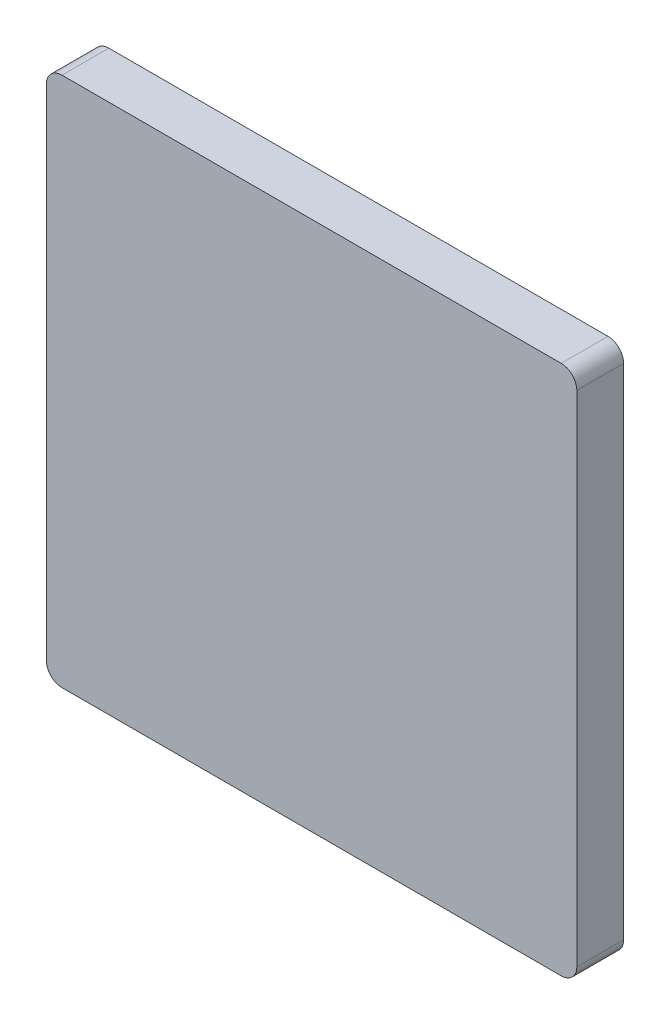
ISO-10303-21;
HEADER;
FILE_DESCRIPTION(('STEP AP214'),'2;1');
FILE_NAME('part.step','',(''),(''),'','','');
FILE_SCHEMA(('AUTOMOTIVE_DESIGN { 1 0 10303 214 1 1 1 1 }'));
ENDSEC;
DATA;
#1=APPLICATION_CONTEXT('core data for automotive mechanical design processes');
#2=APPLICATION_PROTOCOL_DEFINITION('international standard','automotive_design',2000,#1);
#3=PRODUCT_CONTEXT('',#1,'mechanical');
#4=PRODUCT('Part','Part','',(#3));
#5=PRODUCT_RELATED_PRODUCT_CATEGORY('part','',(#4));
#6=PRODUCT_DEFINITION_FORMATION('','',#4);
#7=PRODUCT_DEFINITION_CONTEXT('part definition',#1,'design');
#8=PRODUCT_DEFINITION('design','',#6,#7);
#9=PRODUCT_DEFINITION_SHAPE('','',#8);
#10=(LENGTH_UNIT() NAMED_UNIT(*) SI_UNIT(.MILLI.,.METRE.));
#11=(NAMED_UNIT(*) PLANE_ANGLE_UNIT() SI_UNIT($,.RADIAN.));
#12=(NAMED_UNIT(*) SI_UNIT($,.STERADIAN.) SOLID_ANGLE_UNIT());
#13=UNCERTAINTY_MEASURE_WITH_UNIT(LENGTH_MEASURE(1.E-05),#10,'distance_accuracy_value','');
#14=(GEOMETRIC_REPRESENTATION_CONTEXT(3) GLOBAL_UNCERTAINTY_ASSIGNED_CONTEXT((#13)) GLOBAL_UNIT_ASSIGNED_CONTEXT((#10,
#11,#12)) REPRESENTATION_CONTEXT('',''));
#15=CARTESIAN_POINT('',(0.,0.,0.));
#16=DIRECTION('',(0.,0.,1.));
#17=DIRECTION('',(1.,0.,0.));
#18=AXIS2_PLACEMENT_3D('',#15,#16,#17);
#19=CARTESIAN_POINT('',(0.,0.,0.6));
#20=DIRECTION('',(1.,0.,0.));
#21=DIRECTION('',(0.,0.,-1.));
#22=AXIS2_PLACEMENT_3D('',#19,#20,#21);
#23=PLANE('',#22);
#24=DIRECTION('',(0.,-1.,0.));
#25=VECTOR('',#24,1.);
#26=CARTESIAN_POINT('',(0.,0.,0.));
#27=LINE('',#26,#25);
#28=CARTESIAN_POINT('',(0.,6.6,0.));
#29=VERTEX_POINT('',#28);
#30=CARTESIAN_POINT('',(0.,0.2,0.));
#31=VERTEX_POINT('',#30);
#32=EDGE_CURVE('E127',#29,#31,#27,.T.);
#33=ORIENTED_EDGE('',*,*,#32,.T.);
#34=DIRECTION('',(0.,0.,-1.));
#35=VECTOR('',#34,1.);
#36=CARTESIAN_POINT('',(0.,0.2,0.6));
#37=LINE('',#36,#35);
#38=CARTESIAN_POINT('',(0.,0.2,0.6));
#39=VERTEX_POINT('',#38);
#40=EDGE_CURVE('E105',#31,#39,#37,.F.);
#41=ORIENTED_EDGE('',*,*,#40,.T.);
#42=DIRECTION('',(0.,-1.,0.));
#43=VECTOR('',#42,1.);
#44=CARTESIAN_POINT('',(0.,0.,0.6));
#45=LINE('',#44,#43);
#46=CARTESIAN_POINT('',(0.,6.6,0.6));
#47=VERTEX_POINT('',#46);
#48=EDGE_CURVE('E136',#47,#39,#45,.T.);
#49=ORIENTED_EDGE('',*,*,#48,.F.);
#50=DIRECTION('',(0.,0.,-1.));
#51=VECTOR('',#50,1.);
#52=CARTESIAN_POINT('',(0.,6.6,0.6));
#53=LINE('',#52,#51);
#54=EDGE_CURVE('E110',#47,#29,#53,.T.);
#55=ORIENTED_EDGE('',*,*,#54,.T.);
#56=EDGE_LOOP('',(#33,#41,#49,#55));
#57=FACE_BOUND('',#56,.T.);
#58=ADVANCED_FACE('F34',(#57),#23,.F.);
#59=CARTESIAN_POINT('',(0.,0.,0.6));
#60=DIRECTION('',(0.,1.,0.));
#61=DIRECTION('',(0.,0.,1.));
#62=AXIS2_PLACEMENT_3D('',#59,#60,#61);
#63=PLANE('',#62);
#64=DIRECTION('',(1.,0.,0.));
#65=VECTOR('',#64,1.);
#66=CARTESIAN_POINT('',(0.,0.,0.6));
#67=LINE('',#66,#65);
#68=CARTESIAN_POINT('',(0.2,0.,0.6));
#69=VERTEX_POINT('',#68);
#70=CARTESIAN_POINT('',(6.6,0.,0.6));
#71=VERTEX_POINT('',#70);
#72=EDGE_CURVE('E120',#69,#71,#67,.T.);
#73=ORIENTED_EDGE('',*,*,#72,.F.);
#74=DIRECTION('',(0.,0.,-1.));
#75=VECTOR('',#74,1.);
#76=CARTESIAN_POINT('',(0.2,0.,0.6));
#77=LINE('',#76,#75);
#78=CARTESIAN_POINT('',(0.2,0.,0.));
#79=VERTEX_POINT('',#78);
#80=EDGE_CURVE('E104',#69,#79,#77,.T.);
#81=ORIENTED_EDGE('',*,*,#80,.T.);
#82=DIRECTION('',(1.,0.,0.));
#83=VECTOR('',#82,1.);
#84=CARTESIAN_POINT('',(0.,0.,0.));
#85=LINE('',#84,#83);
#86=CARTESIAN_POINT('',(6.6,0.,0.));
#87=VERTEX_POINT('',#86);
#88=EDGE_CURVE('E117',#79,#87,#85,.T.);
#89=ORIENTED_EDGE('',*,*,#88,.T.);
#90=DIRECTION('',(0.,0.,-1.));
#91=VECTOR('',#90,1.);
#92=CARTESIAN_POINT('',(6.6,0.,0.6));
#93=LINE('',#92,#91);
#94=EDGE_CURVE('E122',#87,#71,#93,.F.);
#95=ORIENTED_EDGE('',*,*,#94,.T.);
#96=EDGE_LOOP('',(#73,#81,#89,#95));
#97=FACE_BOUND('',#96,.T.);
#98=ADVANCED_FACE('F116',(#97),#63,.F.);
#99=CARTESIAN_POINT('',(6.8,0.,0.6));
#100=DIRECTION('',(-1.,0.,0.));
#101=DIRECTION('',(0.,0.,1.));
#102=AXIS2_PLACEMENT_3D('',#99,#100,#101);
#103=PLANE('',#102);
#104=DIRECTION('',(0.,1.,0.));
#105=VECTOR('',#104,1.);
#106=CARTESIAN_POINT('',(6.8,0.,0.6));
#107=LINE('',#106,#105);
#108=CARTESIAN_POINT('',(6.8,0.2,0.6));
#109=VERTEX_POINT('',#108);
#110=CARTESIAN_POINT('',(6.8,6.6,0.6));
#111=VERTEX_POINT('',#110);
#112=EDGE_CURVE('E162',#109,#111,#107,.T.);
#113=ORIENTED_EDGE('',*,*,#112,.F.);
#114=DIRECTION('',(0.,0.,-1.));
#115=VECTOR('',#114,1.);
#116=CARTESIAN_POINT('',(6.8,0.2,0.6));
#117=LINE('',#116,#115);
#118=CARTESIAN_POINT('',(6.8,0.2,0.));
#119=VERTEX_POINT('',#118);
#120=EDGE_CURVE('E155',#109,#119,#117,.T.);
#121=ORIENTED_EDGE('',*,*,#120,.T.);
#122=DIRECTION('',(0.,1.,0.));
#123=VECTOR('',#122,1.);
#124=CARTESIAN_POINT('',(6.8,0.,0.));
#125=LINE('',#124,#123);
#126=CARTESIAN_POINT('',(6.8,6.6,0.));
#127=VERTEX_POINT('',#126);
#128=EDGE_CURVE('E126',#119,#127,#125,.T.);
#129=ORIENTED_EDGE('',*,*,#128,.T.);
#130=DIRECTION('',(0.,0.,-1.));
#131=VECTOR('',#130,1.);
#132=CARTESIAN_POINT('',(6.8,6.6,0.6));
#133=LINE('',#132,#131);
#134=EDGE_CURVE('E153',#127,#111,#133,.F.);
#135=ORIENTED_EDGE('',*,*,#134,.T.);
#136=EDGE_LOOP('',(#113,#121,#129,#135));
#137=FACE_BOUND('',#136,.T.);
#138=ADVANCED_FACE('F160',(#137),#103,.F.);
#139=CARTESIAN_POINT('',(0.,6.8,0.6));
#140=DIRECTION('',(0.,-1.,0.));
#141=DIRECTION('',(0.,0.,-1.));
#142=AXIS2_PLACEMENT_3D('',#139,#140,#141);
#143=PLANE('',#142);
#144=DIRECTION('',(-1.,0.,0.));
#145=VECTOR('',#144,1.);
#146=CARTESIAN_POINT('',(0.,6.8,0.6));
#147=LINE('',#146,#145);
#148=CARTESIAN_POINT('',(6.6,6.8,0.6));
#149=VERTEX_POINT('',#148);
#150=CARTESIAN_POINT('',(0.2,6.8,0.6));
#151=VERTEX_POINT('',#150);
#152=EDGE_CURVE('E137',#149,#151,#147,.T.);
#153=ORIENTED_EDGE('',*,*,#152,.F.);
#154=DIRECTION('',(0.,0.,-1.));
#155=VECTOR('',#154,1.);
#156=CARTESIAN_POINT('',(6.6,6.8,0.6));
#157=LINE('',#156,#155);
#158=CARTESIAN_POINT('',(6.6,6.8,0.));
#159=VERTEX_POINT('',#158);
#160=EDGE_CURVE('E11',#149,#159,#157,.T.);
#161=ORIENTED_EDGE('',*,*,#160,.T.);
#162=DIRECTION('',(-1.,0.,0.));
#163=VECTOR('',#162,1.);
#164=CARTESIAN_POINT('',(0.,6.8,0.));
#165=LINE('',#164,#163);
#166=CARTESIAN_POINT('',(0.2,6.8,0.));
#167=VERTEX_POINT('',#166);
#168=EDGE_CURVE('E130',#159,#167,#165,.T.);
#169=ORIENTED_EDGE('',*,*,#168,.T.);
#170=DIRECTION('',(0.,0.,-1.));
#171=VECTOR('',#170,1.);
#172=CARTESIAN_POINT('',(0.2,6.8,0.6));
#173=LINE('',#172,#171);
#174=EDGE_CURVE('E42',#167,#151,#173,.F.);
#175=ORIENTED_EDGE('',*,*,#174,.T.);
#176=EDGE_LOOP('',(#153,#161,#169,#175));
#177=FACE_BOUND('',#176,.T.);
#178=ADVANCED_FACE('F169',(#177),#143,.F.);
#179=CARTESIAN_POINT('',(0.,0.,0.6));
#180=DIRECTION('',(0.,0.,-1.));
#181=DIRECTION('',(-1.,0.,0.));
#182=AXIS2_PLACEMENT_3D('',#179,#180,#181);
#183=PLANE('',#182);
#184=ORIENTED_EDGE('',*,*,#48,.T.);
#185=CARTESIAN_POINT('',(0.2,0.2,0.6));
#186=DIRECTION('',(0.,0.,-1.));
#187=DIRECTION('',(-1.,0.,0.));
#188=AXIS2_PLACEMENT_3D('',#185,#186,#187);
#189=CIRCLE('',#188,0.2);
#190=EDGE_CURVE('E151',#39,#69,#189,.F.);
#191=ORIENTED_EDGE('',*,*,#190,.T.);
#192=ORIENTED_EDGE('',*,*,#72,.T.);
#193=CARTESIAN_POINT('',(6.6,0.2,0.6));
#194=DIRECTION('',(0.,0.,-1.));
#195=DIRECTION('',(-1.,0.,0.));
#196=AXIS2_PLACEMENT_3D('',#193,#194,#195);
#197=CIRCLE('',#196,0.2);
#198=EDGE_CURVE('E149',#71,#109,#197,.F.);
#199=ORIENTED_EDGE('',*,*,#198,.T.);
#200=ORIENTED_EDGE('',*,*,#112,.T.);
#201=CARTESIAN_POINT('',(6.6,6.6,0.6));
#202=DIRECTION('',(0.,0.,-1.));
#203=DIRECTION('',(-1.,0.,0.));
#204=AXIS2_PLACEMENT_3D('',#201,#202,#203);
#205=CIRCLE('',#204,0.2);
#206=EDGE_CURVE('E55',#111,#149,#205,.F.);
#207=ORIENTED_EDGE('',*,*,#206,.T.);
#208=ORIENTED_EDGE('',*,*,#152,.T.);
#209=CARTESIAN_POINT('',(0.2,6.6,0.6));
#210=DIRECTION('',(0.,0.,-1.));
#211=DIRECTION('',(-1.,0.,0.));
#212=AXIS2_PLACEMENT_3D('',#209,#210,#211);
#213=CIRCLE('',#212,0.2);
#214=EDGE_CURVE('E146',#151,#47,#213,.F.);
#215=ORIENTED_EDGE('',*,*,#214,.T.);
#216=EDGE_LOOP('',(#184,#191,#192,#199,#200,#207,#208,#215));
#217=FACE_BOUND('',#216,.T.);
#218=ADVANCED_FACE('F176',(#217),#183,.F.);
#219=CARTESIAN_POINT('',(0.,0.,0.));
#220=DIRECTION('',(0.,0.,-1.));
#221=DIRECTION('',(-1.,0.,0.));
#222=AXIS2_PLACEMENT_3D('',#219,#220,#221);
#223=PLANE('',#222);
#224=ORIENTED_EDGE('',*,*,#88,.F.);
#225=CARTESIAN_POINT('',(0.2,0.2,0.));
#226=DIRECTION('',(0.,0.,-1.));
#227=DIRECTION('',(-1.,0.,0.));
#228=AXIS2_PLACEMENT_3D('',#225,#226,#227);
#229=CIRCLE('',#228,0.2);
#230=EDGE_CURVE('E100',#79,#31,#229,.T.);
#231=ORIENTED_EDGE('',*,*,#230,.T.);
#232=ORIENTED_EDGE('',*,*,#32,.F.);
#233=CARTESIAN_POINT('',(0.2,6.6,0.));
#234=DIRECTION('',(0.,0.,-1.));
#235=DIRECTION('',(-1.,0.,0.));
#236=AXIS2_PLACEMENT_3D('',#233,#234,#235);
#237=CIRCLE('',#236,0.2);
#238=EDGE_CURVE('E121',#29,#167,#237,.T.);
#239=ORIENTED_EDGE('',*,*,#238,.T.);
#240=ORIENTED_EDGE('',*,*,#168,.F.);
#241=CARTESIAN_POINT('',(6.6,6.6,0.));
#242=DIRECTION('',(0.,0.,-1.));
#243=DIRECTION('',(-1.,0.,0.));
#244=AXIS2_PLACEMENT_3D('',#241,#242,#243);
#245=CIRCLE('',#244,0.2);
#246=EDGE_CURVE('E140',#159,#127,#245,.T.);
#247=ORIENTED_EDGE('',*,*,#246,.T.);
#248=ORIENTED_EDGE('',*,*,#128,.F.);
#249=CARTESIAN_POINT('',(6.6,0.2,0.));
#250=DIRECTION('',(0.,0.,-1.));
#251=DIRECTION('',(-1.,0.,0.));
#252=AXIS2_PLACEMENT_3D('',#249,#250,#251);
#253=CIRCLE('',#252,0.2);
#254=EDGE_CURVE('E111',#119,#87,#253,.T.);
#255=ORIENTED_EDGE('',*,*,#254,.T.);
#256=EDGE_LOOP('',(#224,#231,#232,#239,#240,#247,#248,#255));
#257=FACE_BOUND('',#256,.T.);
#258=ADVANCED_FACE('F124',(#257),#223,.T.);
#259=CARTESIAN_POINT('',(0.2,0.2,0.6));
#260=DIRECTION('',(0.,0.,-1.));
#261=DIRECTION('',(-1.,0.,0.));
#262=AXIS2_PLACEMENT_3D('',#259,#260,#261);
#263=CYLINDRICAL_SURFACE('',#262,0.2);
#264=ORIENTED_EDGE('',*,*,#190,.F.);
#265=ORIENTED_EDGE('',*,*,#40,.F.);
#266=ORIENTED_EDGE('',*,*,#230,.F.);
#267=ORIENTED_EDGE('',*,*,#80,.F.);
#268=EDGE_LOOP('',(#264,#265,#266,#267));
#269=FACE_BOUND('',#268,.T.);
#270=ADVANCED_FACE('F103',(#269),#263,.T.);
#271=CARTESIAN_POINT('',(6.6,0.2,0.6));
#272=DIRECTION('',(0.,0.,-1.));
#273=DIRECTION('',(-1.,0.,0.));
#274=AXIS2_PLACEMENT_3D('',#271,#272,#273);
#275=CYLINDRICAL_SURFACE('',#274,0.2);
#276=ORIENTED_EDGE('',*,*,#198,.F.);
#277=ORIENTED_EDGE('',*,*,#94,.F.);
#278=ORIENTED_EDGE('',*,*,#254,.F.);
#279=ORIENTED_EDGE('',*,*,#120,.F.);
#280=EDGE_LOOP('',(#276,#277,#278,#279));
#281=FACE_BOUND('',#280,.T.);
#282=ADVANCED_FACE('F184',(#281),#275,.T.);
#283=CARTESIAN_POINT('',(6.6,6.6,0.6));
#284=DIRECTION('',(0.,0.,-1.));
#285=DIRECTION('',(-1.,0.,0.));
#286=AXIS2_PLACEMENT_3D('',#283,#284,#285);
#287=CYLINDRICAL_SURFACE('',#286,0.2);
#288=ORIENTED_EDGE('',*,*,#206,.F.);
#289=ORIENTED_EDGE('',*,*,#134,.F.);
#290=ORIENTED_EDGE('',*,*,#246,.F.);
#291=ORIENTED_EDGE('',*,*,#160,.F.);
#292=EDGE_LOOP('',(#288,#289,#290,#291));
#293=FACE_BOUND('',#292,.T.);
#294=ADVANCED_FACE('F168',(#293),#287,.T.);
#295=CARTESIAN_POINT('',(0.2,6.6,0.6));
#296=DIRECTION('',(0.,0.,-1.));
#297=DIRECTION('',(-1.,0.,0.));
#298=AXIS2_PLACEMENT_3D('',#295,#296,#297);
#299=CYLINDRICAL_SURFACE('',#298,0.2);
#300=ORIENTED_EDGE('',*,*,#214,.F.);
#301=ORIENTED_EDGE('',*,*,#174,.F.);
#302=ORIENTED_EDGE('',*,*,#238,.F.);
#303=ORIENTED_EDGE('',*,*,#54,.F.);
#304=EDGE_LOOP('',(#300,#301,#302,#303));
#305=FACE_BOUND('',#304,.T.);
#306=ADVANCED_FACE('F36',(#305),#299,.T.);
#307=CLOSED_SHELL('',(#58,#98,#138,#178,#218,#258,#270,#282,#294,#306));
#308=MANIFOLD_SOLID_BREP('B2',#307);
#309=ADVANCED_BREP_SHAPE_REPRESENTATION('',(#18,#308),#14);
#310=SHAPE_DEFINITION_REPRESENTATION(#9,#309);
ENDSEC;
END-ISO-10303-21;
